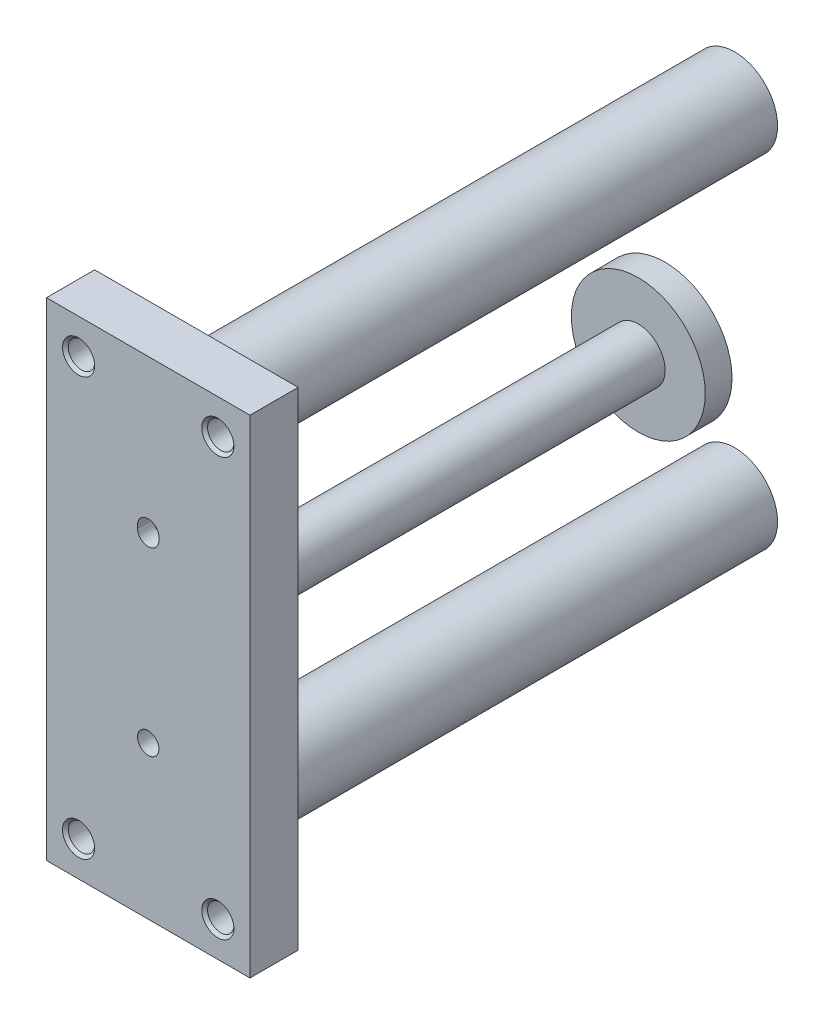
ISO-10303-21;
HEADER;
FILE_DESCRIPTION(('STEP AP214'),'2;1');
FILE_NAME('part.step','',(''),(''),'','','');
FILE_SCHEMA(('AUTOMOTIVE_DESIGN { 1 0 10303 214 1 1 1 1 }'));
ENDSEC;
DATA;
#1=APPLICATION_CONTEXT('core data for automotive mechanical design processes');
#2=APPLICATION_PROTOCOL_DEFINITION('international standard','automotive_design',2000,#1);
#3=PRODUCT_CONTEXT('',#1,'mechanical');
#4=PRODUCT('Part','Part','',(#3));
#5=PRODUCT_RELATED_PRODUCT_CATEGORY('part','',(#4));
#6=PRODUCT_DEFINITION_FORMATION('','',#4);
#7=PRODUCT_DEFINITION_CONTEXT('part definition',#1,'design');
#8=PRODUCT_DEFINITION('design','',#6,#7);
#9=PRODUCT_DEFINITION_SHAPE('','',#8);
#10=(LENGTH_UNIT() NAMED_UNIT(*) SI_UNIT(.MILLI.,.METRE.));
#11=(NAMED_UNIT(*) PLANE_ANGLE_UNIT() SI_UNIT($,.RADIAN.));
#12=(NAMED_UNIT(*) SI_UNIT($,.STERADIAN.) SOLID_ANGLE_UNIT());
#13=UNCERTAINTY_MEASURE_WITH_UNIT(LENGTH_MEASURE(1.E-05),#10,'distance_accuracy_value','');
#14=(GEOMETRIC_REPRESENTATION_CONTEXT(3) GLOBAL_UNCERTAINTY_ASSIGNED_CONTEXT((#13)) GLOBAL_UNIT_ASSIGNED_CONTEXT((#10,
#11,#12)) REPRESENTATION_CONTEXT('',''));
#15=CARTESIAN_POINT('',(0.,0.,0.));
#16=DIRECTION('',(0.,0.,1.));
#17=DIRECTION('',(1.,0.,0.));
#18=AXIS2_PLACEMENT_3D('',#15,#16,#17);
#19=CARTESIAN_POINT('',(-19.,-45.5,21.));
#20=DIRECTION('',(-1.,0.,0.));
#21=DIRECTION('',(0.,0.,1.));
#22=AXIS2_PLACEMENT_3D('',#19,#20,#21);
#23=PLANE('',#22);
#24=DIRECTION('',(0.,1.,0.));
#25=VECTOR('',#24,1.);
#26=CARTESIAN_POINT('',(-19.,-45.5,30.));
#27=LINE('',#26,#25);
#28=CARTESIAN_POINT('',(-19.,45.5,30.));
#29=VERTEX_POINT('',#28);
#30=CARTESIAN_POINT('',(-19.,-45.5,30.));
#31=VERTEX_POINT('',#30);
#32=EDGE_CURVE('E91',#29,#31,#27,.F.);
#33=ORIENTED_EDGE('',*,*,#32,.F.);
#34=DIRECTION('',(0.,0.,-1.));
#35=VECTOR('',#34,1.);
#36=CARTESIAN_POINT('',(-19.,45.5,30.));
#37=LINE('',#36,#35);
#38=CARTESIAN_POINT('',(-19.,45.5,21.));
#39=VERTEX_POINT('',#38);
#40=EDGE_CURVE('E106',#39,#29,#37,.F.);
#41=ORIENTED_EDGE('',*,*,#40,.F.);
#42=DIRECTION('',(0.,-1.,0.));
#43=VECTOR('',#42,1.);
#44=CARTESIAN_POINT('',(-19.,45.5,21.));
#45=LINE('',#44,#43);
#46=CARTESIAN_POINT('',(-19.,-45.5,21.));
#47=VERTEX_POINT('',#46);
#48=EDGE_CURVE('E112',#39,#47,#45,.T.);
#49=ORIENTED_EDGE('',*,*,#48,.T.);
#50=DIRECTION('',(0.,0.,1.));
#51=VECTOR('',#50,1.);
#52=CARTESIAN_POINT('',(-19.,-45.5,21.));
#53=LINE('',#52,#51);
#54=EDGE_CURVE('E108',#47,#31,#53,.T.);
#55=ORIENTED_EDGE('',*,*,#54,.T.);
#56=EDGE_LOOP('',(#33,#41,#49,#55));
#57=FACE_BOUND('',#56,.T.);
#58=ADVANCED_FACE('F17',(#57),#23,.T.);
#59=CARTESIAN_POINT('',(-19.,-45.5,30.));
#60=DIRECTION('',(0.,-1.,0.));
#61=DIRECTION('',(0.,0.,-1.));
#62=AXIS2_PLACEMENT_3D('',#59,#60,#61);
#63=PLANE('',#62);
#64=DIRECTION('',(-1.,0.,0.));
#65=VECTOR('',#64,1.);
#66=CARTESIAN_POINT('',(19.,-45.5,30.));
#67=LINE('',#66,#65);
#68=CARTESIAN_POINT('',(19.,-45.5,30.));
#69=VERTEX_POINT('',#68);
#70=EDGE_CURVE('E123',#31,#69,#67,.F.);
#71=ORIENTED_EDGE('',*,*,#70,.F.);
#72=ORIENTED_EDGE('',*,*,#54,.F.);
#73=DIRECTION('',(1.,0.,0.));
#74=VECTOR('',#73,1.);
#75=CARTESIAN_POINT('',(-19.,-45.5,21.));
#76=LINE('',#75,#74);
#77=CARTESIAN_POINT('',(19.,-45.5,21.));
#78=VERTEX_POINT('',#77);
#79=EDGE_CURVE('E127',#47,#78,#76,.T.);
#80=ORIENTED_EDGE('',*,*,#79,.T.);
#81=DIRECTION('',(0.,0.,1.));
#82=VECTOR('',#81,1.);
#83=CARTESIAN_POINT('',(19.,-45.5,21.));
#84=LINE('',#83,#82);
#85=EDGE_CURVE('E132',#78,#69,#84,.T.);
#86=ORIENTED_EDGE('',*,*,#85,.T.);
#87=EDGE_LOOP('',(#71,#72,#80,#86));
#88=FACE_BOUND('',#87,.T.);
#89=ADVANCED_FACE('F319',(#88),#63,.T.);
#90=CARTESIAN_POINT('',(19.,-45.5,30.));
#91=DIRECTION('',(1.,0.,0.));
#92=DIRECTION('',(0.,0.,-1.));
#93=AXIS2_PLACEMENT_3D('',#90,#91,#92);
#94=PLANE('',#93);
#95=DIRECTION('',(0.,-1.,0.));
#96=VECTOR('',#95,1.);
#97=CARTESIAN_POINT('',(19.,45.5,30.));
#98=LINE('',#97,#96);
#99=CARTESIAN_POINT('',(19.,45.5,30.));
#100=VERTEX_POINT('',#99);
#101=EDGE_CURVE('E94',#69,#100,#98,.F.);
#102=ORIENTED_EDGE('',*,*,#101,.F.);
#103=ORIENTED_EDGE('',*,*,#85,.F.);
#104=DIRECTION('',(0.,1.,0.));
#105=VECTOR('',#104,1.);
#106=CARTESIAN_POINT('',(19.,-45.5,21.));
#107=LINE('',#106,#105);
#108=CARTESIAN_POINT('',(19.,45.5,21.));
#109=VERTEX_POINT('',#108);
#110=EDGE_CURVE('E140',#78,#109,#107,.T.);
#111=ORIENTED_EDGE('',*,*,#110,.T.);
#112=DIRECTION('',(0.,0.,1.));
#113=VECTOR('',#112,1.);
#114=CARTESIAN_POINT('',(19.,45.5,21.));
#115=LINE('',#114,#113);
#116=EDGE_CURVE('E100',#109,#100,#115,.T.);
#117=ORIENTED_EDGE('',*,*,#116,.T.);
#118=EDGE_LOOP('',(#102,#103,#111,#117));
#119=FACE_BOUND('',#118,.T.);
#120=ADVANCED_FACE('F324',(#119),#94,.T.);
#121=CARTESIAN_POINT('',(-19.,45.5,21.));
#122=DIRECTION('',(0.,1.,0.));
#123=DIRECTION('',(0.,0.,1.));
#124=AXIS2_PLACEMENT_3D('',#121,#122,#123);
#125=PLANE('',#124);
#126=DIRECTION('',(1.,0.,0.));
#127=VECTOR('',#126,1.);
#128=CARTESIAN_POINT('',(-19.,45.5,30.));
#129=LINE('',#128,#127);
#130=EDGE_CURVE('E87',#100,#29,#129,.F.);
#131=ORIENTED_EDGE('',*,*,#130,.F.);
#132=ORIENTED_EDGE('',*,*,#116,.F.);
#133=DIRECTION('',(-1.,0.,0.));
#134=VECTOR('',#133,1.);
#135=CARTESIAN_POINT('',(19.,45.5,21.));
#136=LINE('',#135,#134);
#137=EDGE_CURVE('E99',#109,#39,#136,.T.);
#138=ORIENTED_EDGE('',*,*,#137,.T.);
#139=ORIENTED_EDGE('',*,*,#40,.T.);
#140=EDGE_LOOP('',(#131,#132,#138,#139));
#141=FACE_BOUND('',#140,.T.);
#142=ADVANCED_FACE('F111',(#141),#125,.T.);
#143=CARTESIAN_POINT('',(-19.,-45.5,21.));
#144=DIRECTION('',(0.,0.,-1.));
#145=DIRECTION('',(0.,1.,0.));
#146=AXIS2_PLACEMENT_3D('',#143,#144,#145);
#147=PLANE('',#146);
#148=ORIENTED_EDGE('',*,*,#48,.F.);
#149=ORIENTED_EDGE('',*,*,#137,.F.);
#150=ORIENTED_EDGE('',*,*,#110,.F.);
#151=ORIENTED_EDGE('',*,*,#79,.F.);
#152=EDGE_LOOP('',(#148,#149,#150,#151));
#153=FACE_BOUND('',#152,.T.);
#154=CARTESIAN_POINT('',(0.,32.,21.));
#155=DIRECTION('',(0.,0.,1.));
#156=DIRECTION('',(-1.,0.,0.));
#157=AXIS2_PLACEMENT_3D('',#154,#155,#156);
#158=CIRCLE('',#157,8.);
#159=CARTESIAN_POINT('',(-8.,32.,21.));
#160=VERTEX_POINT('',#159);
#161=EDGE_CURVE('E153',#160,#160,#158,.T.);
#162=ORIENTED_EDGE('',*,*,#161,.T.);
#163=EDGE_LOOP('',(#162));
#164=FACE_BOUND('',#163,.T.);
#165=CARTESIAN_POINT('',(0.,-32.,21.));
#166=DIRECTION('',(0.,0.,1.));
#167=DIRECTION('',(-1.,-1.16835607855137E-09,0.));
#168=AXIS2_PLACEMENT_3D('',#165,#166,#167);
#169=CIRCLE('',#168,8.);
#170=CARTESIAN_POINT('',(-8.,-32.0000000093468,21.));
#171=VERTEX_POINT('',#170);
#172=EDGE_CURVE('E158',#171,#171,#169,.T.);
#173=ORIENTED_EDGE('',*,*,#172,.T.);
#174=EDGE_LOOP('',(#173));
#175=FACE_BOUND('',#174,.T.);
#176=CARTESIAN_POINT('',(0.,0.,21.));
#177=DIRECTION('',(0.,0.,1.));
#178=DIRECTION('',(-0.99999999999999,-1.42053909257813E-07,0.));
#179=AXIS2_PLACEMENT_3D('',#176,#177,#178);
#180=CIRCLE('',#179,5.);
#181=CARTESIAN_POINT('',(-4.99999999999995,-7.10269546289066E-07,21.));
#182=VERTEX_POINT('',#181);
#183=EDGE_CURVE('E161',#182,#182,#180,.F.);
#184=ORIENTED_EDGE('',*,*,#183,.F.);
#185=EDGE_LOOP('',(#184));
#186=FACE_BOUND('',#185,.T.);
#187=CARTESIAN_POINT('',(-13.,39.,21.));
#188=DIRECTION('',(0.,0.,1.));
#189=DIRECTION('',(-1.,0.,0.));
#190=AXIS2_PLACEMENT_3D('',#187,#188,#189);
#191=CIRCLE('',#190,3.);
#192=CARTESIAN_POINT('',(-16.,39.,21.));
#193=VERTEX_POINT('',#192);
#194=EDGE_CURVE('E164',#193,#193,#191,.T.);
#195=ORIENTED_EDGE('',*,*,#194,.T.);
#196=EDGE_LOOP('',(#195));
#197=FACE_BOUND('',#196,.T.);
#198=CARTESIAN_POINT('',(13.,39.,21.));
#199=DIRECTION('',(0.,0.,1.));
#200=DIRECTION('',(-1.,0.,0.));
#201=AXIS2_PLACEMENT_3D('',#198,#199,#200);
#202=CIRCLE('',#201,3.);
#203=CARTESIAN_POINT('',(10.,39.,21.));
#204=VERTEX_POINT('',#203);
#205=EDGE_CURVE('E167',#204,#204,#202,.T.);
#206=ORIENTED_EDGE('',*,*,#205,.T.);
#207=EDGE_LOOP('',(#206));
#208=FACE_BOUND('',#207,.T.);
#209=CARTESIAN_POINT('',(-13.,-39.,21.));
#210=DIRECTION('',(0.,0.,1.));
#211=DIRECTION('',(-1.,0.,0.));
#212=AXIS2_PLACEMENT_3D('',#209,#210,#211);
#213=CIRCLE('',#212,3.);
#214=CARTESIAN_POINT('',(-16.,-39.,21.));
#215=VERTEX_POINT('',#214);
#216=EDGE_CURVE('E170',#215,#215,#213,.T.);
#217=ORIENTED_EDGE('',*,*,#216,.T.);
#218=EDGE_LOOP('',(#217));
#219=FACE_BOUND('',#218,.T.);
#220=CARTESIAN_POINT('',(13.,-39.,21.));
#221=DIRECTION('',(0.,0.,1.));
#222=DIRECTION('',(-1.,0.,0.));
#223=AXIS2_PLACEMENT_3D('',#220,#221,#222);
#224=CIRCLE('',#223,3.);
#225=CARTESIAN_POINT('',(10.,-39.,21.));
#226=VERTEX_POINT('',#225);
#227=EDGE_CURVE('E173',#226,#226,#224,.T.);
#228=ORIENTED_EDGE('',*,*,#227,.T.);
#229=EDGE_LOOP('',(#228));
#230=FACE_BOUND('',#229,.T.);
#231=ADVANCED_FACE('F333',(#153,#164,#175,#186,#197,#208,#219,#230),#147,.T.);
#232=CARTESIAN_POINT('',(-19.,-45.5,30.));
#233=DIRECTION('',(0.,0.,1.));
#234=DIRECTION('',(1.,0.,0.));
#235=AXIS2_PLACEMENT_3D('',#232,#233,#234);
#236=PLANE('',#235);
#237=ORIENTED_EDGE('',*,*,#32,.T.);
#238=ORIENTED_EDGE('',*,*,#70,.T.);
#239=ORIENTED_EDGE('',*,*,#101,.T.);
#240=ORIENTED_EDGE('',*,*,#130,.T.);
#241=EDGE_LOOP('',(#237,#238,#239,#240));
#242=FACE_BOUND('',#241,.T.);
#243=CARTESIAN_POINT('',(13.,39.,30.));
#244=DIRECTION('',(0.,0.,-1.));
#245=DIRECTION('',(1.,0.,0.));
#246=AXIS2_PLACEMENT_3D('',#243,#244,#245);
#247=CIRCLE('',#246,3.00000000000001);
#248=CARTESIAN_POINT('',(16.,39.,30.));
#249=VERTEX_POINT('',#248);
#250=EDGE_CURVE('E176',#249,#249,#247,.F.);
#251=ORIENTED_EDGE('',*,*,#250,.F.);
#252=EDGE_LOOP('',(#251));
#253=FACE_BOUND('',#252,.T.);
#254=CARTESIAN_POINT('',(-13.,-39.,30.));
#255=DIRECTION('',(0.,0.,-1.));
#256=DIRECTION('',(1.,0.,0.));
#257=AXIS2_PLACEMENT_3D('',#254,#255,#256);
#258=CIRCLE('',#257,3.00000000000001);
#259=CARTESIAN_POINT('',(-9.99999999999999,-39.,30.));
#260=VERTEX_POINT('',#259);
#261=EDGE_CURVE('E179',#260,#260,#258,.F.);
#262=ORIENTED_EDGE('',*,*,#261,.F.);
#263=EDGE_LOOP('',(#262));
#264=FACE_BOUND('',#263,.T.);
#265=CARTESIAN_POINT('',(13.,-39.,30.));
#266=DIRECTION('',(0.,0.,-1.));
#267=DIRECTION('',(1.,0.,0.));
#268=AXIS2_PLACEMENT_3D('',#265,#266,#267);
#269=CIRCLE('',#268,3.00000000000001);
#270=CARTESIAN_POINT('',(16.,-39.,30.));
#271=VERTEX_POINT('',#270);
#272=EDGE_CURVE('E182',#271,#271,#269,.F.);
#273=ORIENTED_EDGE('',*,*,#272,.F.);
#274=EDGE_LOOP('',(#273));
#275=FACE_BOUND('',#274,.T.);
#276=CARTESIAN_POINT('',(-13.,39.,30.));
#277=DIRECTION('',(0.,0.,-1.));
#278=DIRECTION('',(1.,0.,0.));
#279=AXIS2_PLACEMENT_3D('',#276,#277,#278);
#280=CIRCLE('',#279,3.00000000000001);
#281=CARTESIAN_POINT('',(-9.99999999999999,39.,30.));
#282=VERTEX_POINT('',#281);
#283=EDGE_CURVE('E185',#282,#282,#280,.F.);
#284=ORIENTED_EDGE('',*,*,#283,.F.);
#285=EDGE_LOOP('',(#284));
#286=FACE_BOUND('',#285,.T.);
#287=CARTESIAN_POINT('',(0.,17.25,30.));
#288=DIRECTION('',(0.,0.,-1.));
#289=DIRECTION('',(-1.,0.,0.));
#290=AXIS2_PLACEMENT_3D('',#287,#288,#289);
#291=CIRCLE('',#290,2.);
#292=CARTESIAN_POINT('',(2.,17.25,30.));
#293=VERTEX_POINT('',#292);
#294=CARTESIAN_POINT('',(-2.,17.25,30.));
#295=VERTEX_POINT('',#294);
#296=EDGE_CURVE('E188',#293,#295,#291,.F.);
#297=ORIENTED_EDGE('',*,*,#296,.F.);
#298=DIRECTION('',(0.,-1.,0.));
#299=VECTOR('',#298,1.);
#300=CARTESIAN_POINT('',(2.,17.25,30.));
#301=LINE('',#300,#299);
#302=CARTESIAN_POINT('',(2.,16.75,30.));
#303=VERTEX_POINT('',#302);
#304=EDGE_CURVE('E190',#303,#293,#301,.F.);
#305=ORIENTED_EDGE('',*,*,#304,.F.);
#306=CARTESIAN_POINT('',(0.,16.75,30.));
#307=DIRECTION('',(0.,0.,-1.));
#308=DIRECTION('',(1.,0.,0.));
#309=AXIS2_PLACEMENT_3D('',#306,#307,#308);
#310=CIRCLE('',#309,2.);
#311=CARTESIAN_POINT('',(-2.,16.75,30.));
#312=VERTEX_POINT('',#311);
#313=EDGE_CURVE('E195',#312,#303,#310,.F.);
#314=ORIENTED_EDGE('',*,*,#313,.F.);
#315=DIRECTION('',(0.,1.,0.));
#316=VECTOR('',#315,1.);
#317=CARTESIAN_POINT('',(-2.,16.75,30.));
#318=LINE('',#317,#316);
#319=EDGE_CURVE('E199',#295,#312,#318,.F.);
#320=ORIENTED_EDGE('',*,*,#319,.F.);
#321=EDGE_LOOP('',(#297,#305,#314,#320));
#322=FACE_BOUND('',#321,.T.);
#323=CARTESIAN_POINT('',(0.,-17.,30.));
#324=DIRECTION('',(0.,0.,-1.));
#325=DIRECTION('',(1.,0.,0.));
#326=AXIS2_PLACEMENT_3D('',#323,#324,#325);
#327=CIRCLE('',#326,2.);
#328=CARTESIAN_POINT('',(2.,-17.,30.));
#329=VERTEX_POINT('',#328);
#330=EDGE_CURVE('E204',#329,#329,#327,.F.);
#331=ORIENTED_EDGE('',*,*,#330,.F.);
#332=EDGE_LOOP('',(#331));
#333=FACE_BOUND('',#332,.T.);
#334=ADVANCED_FACE('F89',(#242,#253,#264,#275,#286,#322,#333),#236,.T.);
#335=CARTESIAN_POINT('',(12.5,-12.7322042967848,-61.5));
#336=DIRECTION('',(0.,0.,1.));
#337=DIRECTION('',(0.,1.,0.));
#338=AXIS2_PLACEMENT_3D('',#335,#336,#337);
#339=PLANE('',#338);
#340=CARTESIAN_POINT('',(0.,0.,-61.5));
#341=DIRECTION('',(0.,0.,1.));
#342=DIRECTION('',(-1.,0.,0.));
#343=AXIS2_PLACEMENT_3D('',#340,#341,#342);
#344=CIRCLE('',#343,12.5);
#345=CARTESIAN_POINT('',(-12.5,0.,-61.5));
#346=VERTEX_POINT('',#345);
#347=EDGE_CURVE('E209',#346,#346,#344,.F.);
#348=ORIENTED_EDGE('',*,*,#347,.F.);
#349=EDGE_LOOP('',(#348));
#350=FACE_BOUND('',#349,.T.);
#351=CARTESIAN_POINT('',(0.,0.,-61.5));
#352=DIRECTION('',(0.,0.,-1.));
#353=DIRECTION('',(0.99999999999999,-1.42053902507657E-07,0.));
#354=AXIS2_PLACEMENT_3D('',#351,#352,#353);
#355=CIRCLE('',#354,5.);
#356=CARTESIAN_POINT('',(4.99999999999995,-7.10269512538286E-07,-61.5));
#357=VERTEX_POINT('',#356);
#358=EDGE_CURVE('E212',#357,#357,#355,.T.);
#359=ORIENTED_EDGE('',*,*,#358,.T.);
#360=EDGE_LOOP('',(#359));
#361=FACE_BOUND('',#360,.T.);
#362=ADVANCED_FACE('F339',(#350,#361),#339,.T.);
#363=CARTESIAN_POINT('',(-12.5,-12.7322042750372,-66.5));
#364=DIRECTION('',(0.,0.,-1.));
#365=DIRECTION('',(0.,1.,0.));
#366=AXIS2_PLACEMENT_3D('',#363,#364,#365);
#367=PLANE('',#366);
#368=CARTESIAN_POINT('',(0.,0.,-66.5));
#369=DIRECTION('',(0.,0.,-1.));
#370=DIRECTION('',(1.,-1.16851708753529E-09,0.));
#371=AXIS2_PLACEMENT_3D('',#368,#369,#370);
#372=CIRCLE('',#371,12.5);
#373=CARTESIAN_POINT('',(12.5,-1.46064635941911E-08,-66.5));
#374=VERTEX_POINT('',#373);
#375=EDGE_CURVE('E215',#374,#374,#372,.T.);
#376=ORIENTED_EDGE('',*,*,#375,.T.);
#377=EDGE_LOOP('',(#376));
#378=FACE_BOUND('',#377,.T.);
#379=ADVANCED_FACE('F342',(#378),#367,.T.);
#380=CARTESIAN_POINT('',(-2.,16.75,27.));
#381=DIRECTION('',(1.,0.,0.));
#382=DIRECTION('',(0.,1.,0.));
#383=AXIS2_PLACEMENT_3D('',#380,#381,#382);
#384=PLANE('',#383);
#385=DIRECTION('',(0.,1.,0.));
#386=VECTOR('',#385,1.);
#387=CARTESIAN_POINT('',(-2.,17.,27.));
#388=LINE('',#387,#386);
#389=CARTESIAN_POINT('',(-2.,17.25,27.));
#390=VERTEX_POINT('',#389);
#391=CARTESIAN_POINT('',(-2.,17.,27.));
#392=VERTEX_POINT('',#391);
#393=EDGE_CURVE('E218',#390,#392,#388,.F.);
#394=ORIENTED_EDGE('',*,*,#393,.F.);
#395=DIRECTION('',(0.,0.,1.));
#396=VECTOR('',#395,1.);
#397=CARTESIAN_POINT('',(-2.,17.25,27.));
#398=LINE('',#397,#396);
#399=EDGE_CURVE('E221',#390,#295,#398,.T.);
#400=ORIENTED_EDGE('',*,*,#399,.T.);
#401=ORIENTED_EDGE('',*,*,#319,.T.);
#402=DIRECTION('',(0.,0.,-1.));
#403=VECTOR('',#402,1.);
#404=CARTESIAN_POINT('',(-2.,16.75,30.));
#405=LINE('',#404,#403);
#406=CARTESIAN_POINT('',(-2.,16.75,27.));
#407=VERTEX_POINT('',#406);
#408=EDGE_CURVE('E226',#407,#312,#405,.F.);
#409=ORIENTED_EDGE('',*,*,#408,.F.);
#410=DIRECTION('',(0.,1.,0.));
#411=VECTOR('',#410,1.);
#412=CARTESIAN_POINT('',(-2.,16.75,27.));
#413=LINE('',#412,#411);
#414=EDGE_CURVE('E230',#392,#407,#413,.F.);
#415=ORIENTED_EDGE('',*,*,#414,.F.);
#416=EDGE_LOOP('',(#394,#400,#401,#409,#415));
#417=FACE_BOUND('',#416,.T.);
#418=ADVANCED_FACE('F346',(#417),#384,.T.);
#419=CARTESIAN_POINT('',(2.,16.75,30.));
#420=DIRECTION('',(-1.,0.,0.));
#421=DIRECTION('',(0.,1.,0.));
#422=AXIS2_PLACEMENT_3D('',#419,#420,#421);
#423=PLANE('',#422);
#424=DIRECTION('',(0.,-1.,0.));
#425=VECTOR('',#424,1.);
#426=CARTESIAN_POINT('',(2.,17.,27.));
#427=LINE('',#426,#425);
#428=CARTESIAN_POINT('',(2.,16.75,27.));
#429=VERTEX_POINT('',#428);
#430=CARTESIAN_POINT('',(2.,17.,27.));
#431=VERTEX_POINT('',#430);
#432=EDGE_CURVE('E234',#429,#431,#427,.F.);
#433=ORIENTED_EDGE('',*,*,#432,.F.);
#434=DIRECTION('',(0.,0.,1.));
#435=VECTOR('',#434,1.);
#436=CARTESIAN_POINT('',(2.,16.75,27.));
#437=LINE('',#436,#435);
#438=EDGE_CURVE('E239',#429,#303,#437,.T.);
#439=ORIENTED_EDGE('',*,*,#438,.T.);
#440=ORIENTED_EDGE('',*,*,#304,.T.);
#441=DIRECTION('',(0.,0.,-1.));
#442=VECTOR('',#441,1.);
#443=CARTESIAN_POINT('',(2.,17.25,30.));
#444=LINE('',#443,#442);
#445=CARTESIAN_POINT('',(2.,17.25,27.));
#446=VERTEX_POINT('',#445);
#447=EDGE_CURVE('E244',#446,#293,#444,.F.);
#448=ORIENTED_EDGE('',*,*,#447,.F.);
#449=DIRECTION('',(0.,-1.,0.));
#450=VECTOR('',#449,1.);
#451=CARTESIAN_POINT('',(2.,17.25,27.));
#452=LINE('',#451,#450);
#453=EDGE_CURVE('E248',#431,#446,#452,.F.);
#454=ORIENTED_EDGE('',*,*,#453,.F.);
#455=EDGE_LOOP('',(#433,#439,#440,#448,#454));
#456=FACE_BOUND('',#455,.T.);
#457=ADVANCED_FACE('F350',(#456),#423,.T.);
#458=CARTESIAN_POINT('',(-2.,17.,27.));
#459=DIRECTION('',(0.,0.,1.));
#460=DIRECTION('',(1.,0.,0.));
#461=AXIS2_PLACEMENT_3D('',#458,#459,#460);
#462=PLANE('',#461);
#463=ORIENTED_EDGE('',*,*,#453,.T.);
#464=CARTESIAN_POINT('',(0.,17.25,27.));
#465=DIRECTION('',(0.,0.,1.));
#466=DIRECTION('',(1.,0.,0.));
#467=AXIS2_PLACEMENT_3D('',#464,#465,#466);
#468=CIRCLE('',#467,2.);
#469=EDGE_CURVE('E253',#446,#390,#468,.T.);
#470=ORIENTED_EDGE('',*,*,#469,.T.);
#471=ORIENTED_EDGE('',*,*,#393,.T.);
#472=CARTESIAN_POINT('',(0.,17.,27.));
#473=DIRECTION('',(0.,0.,-1.));
#474=DIRECTION('',(-1.,0.,0.));
#475=AXIS2_PLACEMENT_3D('',#472,#473,#474);
#476=CIRCLE('',#475,2.);
#477=EDGE_CURVE('E258',#431,#392,#476,.F.);
#478=ORIENTED_EDGE('',*,*,#477,.F.);
#479=EDGE_LOOP('',(#463,#470,#471,#478));
#480=FACE_BOUND('',#479,.T.);
#481=ADVANCED_FACE('F354',(#480),#462,.T.);
#482=CARTESIAN_POINT('',(0.,17.25,27.));
#483=DIRECTION('',(0.,0.,1.));
#484=DIRECTION('',(1.,0.,0.));
#485=AXIS2_PLACEMENT_3D('',#482,#483,#484);
#486=CYLINDRICAL_SURFACE('',#485,2.);
#487=ORIENTED_EDGE('',*,*,#296,.T.);
#488=ORIENTED_EDGE('',*,*,#399,.F.);
#489=ORIENTED_EDGE('',*,*,#469,.F.);
#490=ORIENTED_EDGE('',*,*,#447,.T.);
#491=EDGE_LOOP('',(#487,#488,#489,#490));
#492=FACE_BOUND('',#491,.T.);
#493=ADVANCED_FACE('F358',(#492),#486,.F.);
#494=CARTESIAN_POINT('',(0.,16.75,27.));
#495=DIRECTION('',(0.,0.,1.));
#496=DIRECTION('',(-1.,0.,0.));
#497=AXIS2_PLACEMENT_3D('',#494,#495,#496);
#498=CYLINDRICAL_SURFACE('',#497,2.);
#499=ORIENTED_EDGE('',*,*,#313,.T.);
#500=ORIENTED_EDGE('',*,*,#438,.F.);
#501=CARTESIAN_POINT('',(0.,16.75,27.));
#502=DIRECTION('',(0.,0.,-1.));
#503=DIRECTION('',(1.,0.,0.));
#504=AXIS2_PLACEMENT_3D('',#501,#502,#503);
#505=CIRCLE('',#504,2.);
#506=EDGE_CURVE('E262',#407,#429,#505,.F.);
#507=ORIENTED_EDGE('',*,*,#506,.F.);
#508=ORIENTED_EDGE('',*,*,#408,.T.);
#509=EDGE_LOOP('',(#499,#500,#507,#508));
#510=FACE_BOUND('',#509,.T.);
#511=ADVANCED_FACE('F362',(#510),#498,.F.);
#512=CARTESIAN_POINT('',(-2.,14.75,27.));
#513=DIRECTION('',(0.,0.,1.));
#514=DIRECTION('',(1.,0.,0.));
#515=AXIS2_PLACEMENT_3D('',#512,#513,#514);
#516=PLANE('',#515);
#517=ORIENTED_EDGE('',*,*,#414,.T.);
#518=ORIENTED_EDGE('',*,*,#506,.T.);
#519=ORIENTED_EDGE('',*,*,#432,.T.);
#520=CARTESIAN_POINT('',(0.,17.,27.));
#521=DIRECTION('',(0.,0.,-1.));
#522=DIRECTION('',(1.,0.,0.));
#523=AXIS2_PLACEMENT_3D('',#520,#521,#522);
#524=CIRCLE('',#523,2.);
#525=EDGE_CURVE('E266',#392,#431,#524,.F.);
#526=ORIENTED_EDGE('',*,*,#525,.F.);
#527=EDGE_LOOP('',(#517,#518,#519,#526));
#528=FACE_BOUND('',#527,.T.);
#529=ADVANCED_FACE('F366',(#528),#516,.T.);
#530=CARTESIAN_POINT('',(8.,-40.2185916476281,-79.5));
#531=DIRECTION('',(0.,0.,-1.));
#532=DIRECTION('',(-1.,0.,0.));
#533=AXIS2_PLACEMENT_3D('',#530,#531,#532);
#534=PLANE('',#533);
#535=CARTESIAN_POINT('',(0.,-32.,-79.5));
#536=DIRECTION('',(0.,0.,-1.));
#537=DIRECTION('',(1.,-1.16835696672979E-09,0.));
#538=AXIS2_PLACEMENT_3D('',#535,#536,#537);
#539=CIRCLE('',#538,8.);
#540=CARTESIAN_POINT('',(8.,-32.0000000093469,-79.5));
#541=VERTEX_POINT('',#540);
#542=EDGE_CURVE('E270',#541,#541,#539,.F.);
#543=ORIENTED_EDGE('',*,*,#542,.F.);
#544=EDGE_LOOP('',(#543));
#545=FACE_BOUND('',#544,.T.);
#546=ADVANCED_FACE('F370',(#545),#534,.T.);
#547=CARTESIAN_POINT('',(8.,23.7814083435289,-79.5));
#548=DIRECTION('',(0.,0.,-1.));
#549=DIRECTION('',(-1.,0.,0.));
#550=AXIS2_PLACEMENT_3D('',#547,#548,#549);
#551=PLANE('',#550);
#552=CARTESIAN_POINT('',(0.,32.,-79.5));
#553=DIRECTION('',(0.,0.,-1.));
#554=DIRECTION('',(1.,0.,0.));
#555=AXIS2_PLACEMENT_3D('',#552,#553,#554);
#556=CIRCLE('',#555,8.);
#557=CARTESIAN_POINT('',(8.,32.,-79.5));
#558=VERTEX_POINT('',#557);
#559=EDGE_CURVE('E275',#558,#558,#556,.F.);
#560=ORIENTED_EDGE('',*,*,#559,.F.);
#561=EDGE_LOOP('',(#560));
#562=FACE_BOUND('',#561,.T.);
#563=ADVANCED_FACE('F374',(#562),#551,.T.);
#564=CARTESIAN_POINT('',(0.,32.,-87.5));
#565=DIRECTION('',(0.,0.,1.));
#566=DIRECTION('',(-1.,1.16835620101605E-09,0.));
#567=AXIS2_PLACEMENT_3D('',#564,#565,#566);
#568=CYLINDRICAL_SURFACE('',#567,8.);
#569=ORIENTED_EDGE('',*,*,#161,.F.);
#570=EDGE_LOOP('',(#569));
#571=FACE_BOUND('',#570,.T.);
#572=ORIENTED_EDGE('',*,*,#559,.T.);
#573=EDGE_LOOP('',(#572));
#574=FACE_BOUND('',#573,.T.);
#575=ADVANCED_FACE('F378',(#571,#574),#568,.T.);
#576=CARTESIAN_POINT('',(0.,-32.,-87.5));
#577=DIRECTION('',(0.,0.,1.));
#578=DIRECTION('',(-1.,0.,0.));
#579=AXIS2_PLACEMENT_3D('',#576,#577,#578);
#580=CYLINDRICAL_SURFACE('',#579,8.);
#581=ORIENTED_EDGE('',*,*,#172,.F.);
#582=EDGE_LOOP('',(#581));
#583=FACE_BOUND('',#582,.T.);
#584=ORIENTED_EDGE('',*,*,#542,.T.);
#585=EDGE_LOOP('',(#584));
#586=FACE_BOUND('',#585,.T.);
#587=ADVANCED_FACE('F382',(#583,#586),#580,.T.);
#588=CARTESIAN_POINT('',(0.,0.,-66.5));
#589=DIRECTION('',(0.,0.,-1.));
#590=DIRECTION('',(1.,0.,0.));
#591=AXIS2_PLACEMENT_3D('',#588,#589,#590);
#592=CYLINDRICAL_SURFACE('',#591,5.);
#593=ORIENTED_EDGE('',*,*,#358,.F.);
#594=EDGE_LOOP('',(#593));
#595=FACE_BOUND('',#594,.T.);
#596=ORIENTED_EDGE('',*,*,#183,.T.);
#597=EDGE_LOOP('',(#596));
#598=FACE_BOUND('',#597,.T.);
#599=ADVANCED_FACE('F386',(#595,#598),#592,.T.);
#600=CARTESIAN_POINT('',(0.,0.,-66.5));
#601=DIRECTION('',(0.,0.,-1.));
#602=DIRECTION('',(1.,0.,0.));
#603=AXIS2_PLACEMENT_3D('',#600,#601,#602);
#604=CYLINDRICAL_SURFACE('',#603,12.5);
#605=ORIENTED_EDGE('',*,*,#375,.F.);
#606=EDGE_LOOP('',(#605));
#607=FACE_BOUND('',#606,.T.);
#608=ORIENTED_EDGE('',*,*,#347,.T.);
#609=EDGE_LOOP('',(#608));
#610=FACE_BOUND('',#609,.T.);
#611=ADVANCED_FACE('F390',(#607,#610),#604,.T.);
#612=CARTESIAN_POINT('',(0.,17.,24.));
#613=DIRECTION('',(0.,0.,1.));
#614=DIRECTION('',(-1.,0.,0.));
#615=AXIS2_PLACEMENT_3D('',#612,#613,#614);
#616=CONICAL_SURFACE('',#615,2.,1.04719755119669);
#617=CARTESIAN_POINT('',(0.,17.,24.));
#618=DIRECTION('',(0.,0.,1.));
#619=DIRECTION('',(-1.,0.,0.));
#620=AXIS2_PLACEMENT_3D('',#617,#618,#619);
#621=CIRCLE('',#620,2.);
#622=CARTESIAN_POINT('',(-2.,17.,24.));
#623=VERTEX_POINT('',#622);
#624=EDGE_CURVE('E278',#623,#623,#621,.T.);
#625=ORIENTED_EDGE('',*,*,#624,.T.);
#626=EDGE_LOOP('',(#625));
#627=FACE_BOUND('',#626,.T.);
#628=CARTESIAN_POINT('',(0.,17.,22.845299461621));
#629=VERTEX_POINT('',#628);
#630=VERTEX_LOOP('',#629);
#631=FACE_BOUND('',#630,.T.);
#632=ADVANCED_FACE('F394',(#627,#631),#616,.F.);
#633=CARTESIAN_POINT('',(0.,17.,30.));
#634=DIRECTION('',(0.,0.,1.));
#635=DIRECTION('',(-1.,7.69313180167128E-10,0.));
#636=AXIS2_PLACEMENT_3D('',#633,#634,#635);
#637=CYLINDRICAL_SURFACE('',#636,2.);
#638=ORIENTED_EDGE('',*,*,#525,.T.);
#639=ORIENTED_EDGE('',*,*,#477,.T.);
#640=EDGE_LOOP('',(#638,#639));
#641=FACE_BOUND('',#640,.T.);
#642=ORIENTED_EDGE('',*,*,#624,.F.);
#643=EDGE_LOOP('',(#642));
#644=FACE_BOUND('',#643,.T.);
#645=ADVANCED_FACE('F398',(#641,#644),#637,.F.);
#646=CARTESIAN_POINT('',(0.,-17.,24.));
#647=DIRECTION('',(0.,0.,1.));
#648=DIRECTION('',(-1.,0.,0.));
#649=AXIS2_PLACEMENT_3D('',#646,#647,#648);
#650=CONICAL_SURFACE('',#649,2.,1.04719755119669);
#651=CARTESIAN_POINT('',(0.,-17.,24.));
#652=DIRECTION('',(0.,0.,1.));
#653=DIRECTION('',(-1.,0.,0.));
#654=AXIS2_PLACEMENT_3D('',#651,#652,#653);
#655=CIRCLE('',#654,2.);
#656=CARTESIAN_POINT('',(-2.,-17.,24.));
#657=VERTEX_POINT('',#656);
#658=EDGE_CURVE('E281',#657,#657,#655,.T.);
#659=ORIENTED_EDGE('',*,*,#658,.T.);
#660=EDGE_LOOP('',(#659));
#661=FACE_BOUND('',#660,.T.);
#662=CARTESIAN_POINT('',(0.,-17.,22.845299461621));
#663=VERTEX_POINT('',#662);
#664=VERTEX_LOOP('',#663);
#665=FACE_BOUND('',#664,.T.);
#666=ADVANCED_FACE('F402',(#661,#665),#650,.F.);
#667=CARTESIAN_POINT('',(0.,-17.,30.));
#668=DIRECTION('',(0.,0.,1.));
#669=DIRECTION('',(-1.,7.69313180167128E-10,0.));
#670=AXIS2_PLACEMENT_3D('',#667,#668,#669);
#671=CYLINDRICAL_SURFACE('',#670,2.);
#672=ORIENTED_EDGE('',*,*,#330,.T.);
#673=EDGE_LOOP('',(#672));
#674=FACE_BOUND('',#673,.T.);
#675=ORIENTED_EDGE('',*,*,#658,.F.);
#676=EDGE_LOOP('',(#675));
#677=FACE_BOUND('',#676,.T.);
#678=ADVANCED_FACE('F406',(#674,#677),#671,.F.);
#679=CARTESIAN_POINT('',(13.,-39.,21.));
#680=DIRECTION('',(0.,0.,-1.));
#681=DIRECTION('',(1.,0.,0.));
#682=AXIS2_PLACEMENT_3D('',#679,#680,#681);
#683=CONICAL_SURFACE('',#682,3.,0.785398163397451);
#684=ORIENTED_EDGE('',*,*,#227,.F.);
#685=EDGE_LOOP('',(#684));
#686=FACE_BOUND('',#685,.T.);
#687=CARTESIAN_POINT('',(13.,-39.,21.5415));
#688=DIRECTION('',(0.,0.,1.));
#689=DIRECTION('',(-1.,0.,0.));
#690=AXIS2_PLACEMENT_3D('',#687,#688,#689);
#691=CIRCLE('',#690,2.4585);
#692=CARTESIAN_POINT('',(10.5415,-39.,21.5415));
#693=VERTEX_POINT('',#692);
#694=EDGE_CURVE('E284',#693,#693,#691,.T.);
#695=ORIENTED_EDGE('',*,*,#694,.T.);
#696=EDGE_LOOP('',(#695));
#697=FACE_BOUND('',#696,.T.);
#698=ADVANCED_FACE('F410',(#686,#697),#683,.F.);
#699=CARTESIAN_POINT('',(13.,-39.,30.));
#700=DIRECTION('',(0.,0.,1.));
#701=DIRECTION('',(-1.,0.,0.));
#702=AXIS2_PLACEMENT_3D('',#699,#700,#701);
#703=CYLINDRICAL_SURFACE('',#702,2.4585);
#704=CARTESIAN_POINT('',(13.,-39.,29.4585));
#705=DIRECTION('',(0.,0.,1.));
#706=DIRECTION('',(-1.,0.,0.));
#707=AXIS2_PLACEMENT_3D('',#704,#705,#706);
#708=CIRCLE('',#707,2.4585);
#709=CARTESIAN_POINT('',(10.5415,-39.,29.4585));
#710=VERTEX_POINT('',#709);
#711=EDGE_CURVE('E287',#710,#710,#708,.T.);
#712=ORIENTED_EDGE('',*,*,#711,.T.);
#713=EDGE_LOOP('',(#712));
#714=FACE_BOUND('',#713,.T.);
#715=ORIENTED_EDGE('',*,*,#694,.F.);
#716=EDGE_LOOP('',(#715));
#717=FACE_BOUND('',#716,.T.);
#718=ADVANCED_FACE('F414',(#714,#717),#703,.F.);
#719=CARTESIAN_POINT('',(13.,-39.,30.));
#720=DIRECTION('',(0.,0.,1.));
#721=DIRECTION('',(-0.99999999999999,1.42053871010968E-07,0.));
#722=AXIS2_PLACEMENT_3D('',#719,#720,#721);
#723=CONICAL_SURFACE('',#722,3.,0.78539816339745);
#724=ORIENTED_EDGE('',*,*,#272,.T.);
#725=EDGE_LOOP('',(#724));
#726=FACE_BOUND('',#725,.T.);
#727=ORIENTED_EDGE('',*,*,#711,.F.);
#728=EDGE_LOOP('',(#727));
#729=FACE_BOUND('',#728,.T.);
#730=ADVANCED_FACE('F418',(#726,#729),#723,.F.);
#731=CARTESIAN_POINT('',(-13.,-39.,21.));
#732=DIRECTION('',(0.,0.,-1.));
#733=DIRECTION('',(1.,0.,0.));
#734=AXIS2_PLACEMENT_3D('',#731,#732,#733);
#735=CONICAL_SURFACE('',#734,3.,0.785398163397451);
#736=ORIENTED_EDGE('',*,*,#216,.F.);
#737=EDGE_LOOP('',(#736));
#738=FACE_BOUND('',#737,.T.);
#739=CARTESIAN_POINT('',(-13.,-39.,21.5415));
#740=DIRECTION('',(0.,0.,1.));
#741=DIRECTION('',(-1.,0.,0.));
#742=AXIS2_PLACEMENT_3D('',#739,#740,#741);
#743=CIRCLE('',#742,2.4585);
#744=CARTESIAN_POINT('',(-15.4585,-39.,21.5415));
#745=VERTEX_POINT('',#744);
#746=EDGE_CURVE('E290',#745,#745,#743,.T.);
#747=ORIENTED_EDGE('',*,*,#746,.T.);
#748=EDGE_LOOP('',(#747));
#749=FACE_BOUND('',#748,.T.);
#750=ADVANCED_FACE('F422',(#738,#749),#735,.F.);
#751=CARTESIAN_POINT('',(-13.,-39.,30.));
#752=DIRECTION('',(0.,0.,1.));
#753=DIRECTION('',(-1.,0.,0.));
#754=AXIS2_PLACEMENT_3D('',#751,#752,#753);
#755=CYLINDRICAL_SURFACE('',#754,2.4585);
#756=CARTESIAN_POINT('',(-13.,-39.,29.4585));
#757=DIRECTION('',(0.,0.,1.));
#758=DIRECTION('',(-1.,0.,0.));
#759=AXIS2_PLACEMENT_3D('',#756,#757,#758);
#760=CIRCLE('',#759,2.4585);
#761=CARTESIAN_POINT('',(-15.4585,-39.,29.4585));
#762=VERTEX_POINT('',#761);
#763=EDGE_CURVE('E293',#762,#762,#760,.T.);
#764=ORIENTED_EDGE('',*,*,#763,.T.);
#765=EDGE_LOOP('',(#764));
#766=FACE_BOUND('',#765,.T.);
#767=ORIENTED_EDGE('',*,*,#746,.F.);
#768=EDGE_LOOP('',(#767));
#769=FACE_BOUND('',#768,.T.);
#770=ADVANCED_FACE('F426',(#766,#769),#755,.F.);
#771=CARTESIAN_POINT('',(-13.,-39.,30.));
#772=DIRECTION('',(0.,0.,1.));
#773=DIRECTION('',(-0.99999999999999,1.42053873231414E-07,0.));
#774=AXIS2_PLACEMENT_3D('',#771,#772,#773);
#775=CONICAL_SURFACE('',#774,3.,0.78539816339745);
#776=ORIENTED_EDGE('',*,*,#261,.T.);
#777=EDGE_LOOP('',(#776));
#778=FACE_BOUND('',#777,.T.);
#779=ORIENTED_EDGE('',*,*,#763,.F.);
#780=EDGE_LOOP('',(#779));
#781=FACE_BOUND('',#780,.T.);
#782=ADVANCED_FACE('F430',(#778,#781),#775,.F.);
#783=CARTESIAN_POINT('',(13.,39.,21.));
#784=DIRECTION('',(0.,0.,-1.));
#785=DIRECTION('',(1.,0.,0.));
#786=AXIS2_PLACEMENT_3D('',#783,#784,#785);
#787=CONICAL_SURFACE('',#786,3.,0.785398163397451);
#788=ORIENTED_EDGE('',*,*,#205,.F.);
#789=EDGE_LOOP('',(#788));
#790=FACE_BOUND('',#789,.T.);
#791=CARTESIAN_POINT('',(13.,39.,21.5415));
#792=DIRECTION('',(0.,0.,1.));
#793=DIRECTION('',(-1.,0.,0.));
#794=AXIS2_PLACEMENT_3D('',#791,#792,#793);
#795=CIRCLE('',#794,2.4585);
#796=CARTESIAN_POINT('',(10.5415,39.,21.5415));
#797=VERTEX_POINT('',#796);
#798=EDGE_CURVE('E296',#797,#797,#795,.T.);
#799=ORIENTED_EDGE('',*,*,#798,.T.);
#800=EDGE_LOOP('',(#799));
#801=FACE_BOUND('',#800,.T.);
#802=ADVANCED_FACE('F434',(#790,#801),#787,.F.);
#803=CARTESIAN_POINT('',(13.,39.,30.));
#804=DIRECTION('',(0.,0.,1.));
#805=DIRECTION('',(-1.,0.,0.));
#806=AXIS2_PLACEMENT_3D('',#803,#804,#805);
#807=CYLINDRICAL_SURFACE('',#806,2.4585);
#808=CARTESIAN_POINT('',(13.,39.,29.4585));
#809=DIRECTION('',(0.,0.,1.));
#810=DIRECTION('',(-1.,0.,0.));
#811=AXIS2_PLACEMENT_3D('',#808,#809,#810);
#812=CIRCLE('',#811,2.4585);
#813=CARTESIAN_POINT('',(10.5415,39.,29.4585));
#814=VERTEX_POINT('',#813);
#815=EDGE_CURVE('E299',#814,#814,#812,.T.);
#816=ORIENTED_EDGE('',*,*,#815,.T.);
#817=EDGE_LOOP('',(#816));
#818=FACE_BOUND('',#817,.T.);
#819=ORIENTED_EDGE('',*,*,#798,.F.);
#820=EDGE_LOOP('',(#819));
#821=FACE_BOUND('',#820,.T.);
#822=ADVANCED_FACE('F438',(#818,#821),#807,.F.);
#823=CARTESIAN_POINT('',(13.,39.,30.));
#824=DIRECTION('',(0.,0.,1.));
#825=DIRECTION('',(-0.99999999999999,1.42053868790521E-07,0.));
#826=AXIS2_PLACEMENT_3D('',#823,#824,#825);
#827=CONICAL_SURFACE('',#826,3.,0.78539816339745);
#828=ORIENTED_EDGE('',*,*,#250,.T.);
#829=EDGE_LOOP('',(#828));
#830=FACE_BOUND('',#829,.T.);
#831=ORIENTED_EDGE('',*,*,#815,.F.);
#832=EDGE_LOOP('',(#831));
#833=FACE_BOUND('',#832,.T.);
#834=ADVANCED_FACE('F315',(#830,#833),#827,.F.);
#835=CARTESIAN_POINT('',(-13.,39.,21.));
#836=DIRECTION('',(0.,0.,-1.));
#837=DIRECTION('',(1.,0.,0.));
#838=AXIS2_PLACEMENT_3D('',#835,#836,#837);
#839=CONICAL_SURFACE('',#838,3.,0.785398163397451);
#840=ORIENTED_EDGE('',*,*,#194,.F.);
#841=EDGE_LOOP('',(#840));
#842=FACE_BOUND('',#841,.T.);
#843=CARTESIAN_POINT('',(-13.,39.,21.5415));
#844=DIRECTION('',(0.,0.,1.));
#845=DIRECTION('',(-1.,0.,0.));
#846=AXIS2_PLACEMENT_3D('',#843,#844,#845);
#847=CIRCLE('',#846,2.4585);
#848=CARTESIAN_POINT('',(-15.4585,39.,21.5415));
#849=VERTEX_POINT('',#848);
#850=EDGE_CURVE('E25',#849,#849,#847,.T.);
#851=ORIENTED_EDGE('',*,*,#850,.T.);
#852=EDGE_LOOP('',(#851));
#853=FACE_BOUND('',#852,.T.);
#854=ADVANCED_FACE('F304',(#842,#853),#839,.F.);
#855=CARTESIAN_POINT('',(-13.,39.,30.));
#856=DIRECTION('',(0.,0.,1.));
#857=DIRECTION('',(-1.,0.,0.));
#858=AXIS2_PLACEMENT_3D('',#855,#856,#857);
#859=CYLINDRICAL_SURFACE('',#858,2.4585);
#860=CARTESIAN_POINT('',(-13.,39.,29.4585));
#861=DIRECTION('',(0.,0.,1.));
#862=DIRECTION('',(-1.,0.,0.));
#863=AXIS2_PLACEMENT_3D('',#860,#861,#862);
#864=CIRCLE('',#863,2.4585);
#865=CARTESIAN_POINT('',(-15.4585,39.,29.4585));
#866=VERTEX_POINT('',#865);
#867=EDGE_CURVE('E11',#866,#866,#864,.T.);
#868=ORIENTED_EDGE('',*,*,#867,.T.);
#869=EDGE_LOOP('',(#868));
#870=FACE_BOUND('',#869,.T.);
#871=ORIENTED_EDGE('',*,*,#850,.F.);
#872=EDGE_LOOP('',(#871));
#873=FACE_BOUND('',#872,.T.);
#874=ADVANCED_FACE('F306',(#870,#873),#859,.F.);
#875=CARTESIAN_POINT('',(-13.,39.,30.));
#876=DIRECTION('',(0.,0.,1.));
#877=DIRECTION('',(-0.99999999999999,1.42053871010968E-07,0.));
#878=AXIS2_PLACEMENT_3D('',#875,#876,#877);
#879=CONICAL_SURFACE('',#878,3.,0.78539816339745);
#880=ORIENTED_EDGE('',*,*,#283,.T.);
#881=EDGE_LOOP('',(#880));
#882=FACE_BOUND('',#881,.T.);
#883=ORIENTED_EDGE('',*,*,#867,.F.);
#884=EDGE_LOOP('',(#883));
#885=FACE_BOUND('',#884,.T.);
#886=ADVANCED_FACE('F19',(#882,#885),#879,.F.);
#887=CLOSED_SHELL('',(#58,#89,#120,#142,#231,#334,#362,#379,#418,#457,#481,#493,#511,#529,#546,
#563,#575,#587,#599,#611,#632,#645,#666,#678,#698,#718,#730,#750,#770,#782,#802,#822,#834,#854,
#874,#886));
#888=MANIFOLD_SOLID_BREP('B1',#887);
#889=ADVANCED_BREP_SHAPE_REPRESENTATION('',(#18,#888),#14);
#890=SHAPE_DEFINITION_REPRESENTATION(#9,#889);
ENDSEC;
END-ISO-10303-21;
